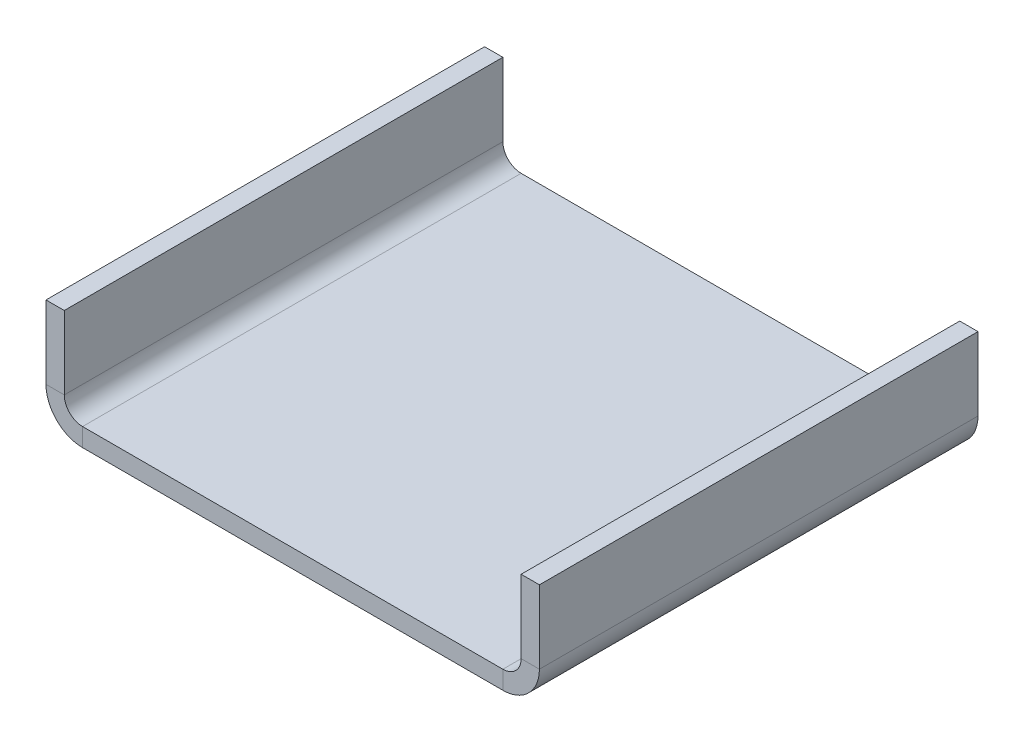
ISO-10303-21;
HEADER;
FILE_DESCRIPTION(('STEP AP214'),'2;1');
FILE_NAME('part.step','',(''),(''),'','','');
FILE_SCHEMA(('AUTOMOTIVE_DESIGN { 1 0 10303 214 1 1 1 1 }'));
ENDSEC;
DATA;
#1=APPLICATION_CONTEXT('core data for automotive mechanical design processes');
#2=APPLICATION_PROTOCOL_DEFINITION('international standard','automotive_design',2000,#1);
#3=PRODUCT_CONTEXT('',#1,'mechanical');
#4=PRODUCT('Part','Part','',(#3));
#5=PRODUCT_RELATED_PRODUCT_CATEGORY('part','',(#4));
#6=PRODUCT_DEFINITION_FORMATION('','',#4);
#7=PRODUCT_DEFINITION_CONTEXT('part definition',#1,'design');
#8=PRODUCT_DEFINITION('design','',#6,#7);
#9=PRODUCT_DEFINITION_SHAPE('','',#8);
#10=(LENGTH_UNIT() NAMED_UNIT(*) SI_UNIT(.MILLI.,.METRE.));
#11=(NAMED_UNIT(*) PLANE_ANGLE_UNIT() SI_UNIT($,.RADIAN.));
#12=(NAMED_UNIT(*) SI_UNIT($,.STERADIAN.) SOLID_ANGLE_UNIT());
#13=UNCERTAINTY_MEASURE_WITH_UNIT(LENGTH_MEASURE(1.E-05),#10,'distance_accuracy_value','');
#14=(GEOMETRIC_REPRESENTATION_CONTEXT(3) GLOBAL_UNCERTAINTY_ASSIGNED_CONTEXT((#13)) GLOBAL_UNIT_ASSIGNED_CONTEXT((#10,
#11,#12)) REPRESENTATION_CONTEXT('',''));
#15=CARTESIAN_POINT('',(0.,0.,0.));
#16=DIRECTION('',(0.,0.,1.));
#17=DIRECTION('',(1.,0.,0.));
#18=AXIS2_PLACEMENT_3D('',#15,#16,#17);
#19=CARTESIAN_POINT('',(0.,6.35,76.2));
#20=DIRECTION('',(0.,0.,1.));
#21=DIRECTION('',(1.,0.,0.));
#22=AXIS2_PLACEMENT_3D('',#19,#20,#21);
#23=PLANE('',#22);
#24=DIRECTION('',(1.,0.,0.));
#25=VECTOR('',#24,1.);
#26=CARTESIAN_POINT('',(0.,6.35,76.2));
#27=LINE('',#26,#25);
#28=CARTESIAN_POINT('',(0.,6.35,76.2));
#29=VERTEX_POINT('',#28);
#30=CARTESIAN_POINT('',(3.175,6.35,76.2));
#31=VERTEX_POINT('',#30);
#32=EDGE_CURVE('E11',#29,#31,#27,.T.);
#33=ORIENTED_EDGE('',*,*,#32,.F.);
#34=CARTESIAN_POINT('',(6.35,6.35,76.2));
#35=DIRECTION('',(0.,0.,-1.));
#36=DIRECTION('',(-1.,0.,0.));
#37=AXIS2_PLACEMENT_3D('',#34,#35,#36);
#38=CIRCLE('',#37,6.35);
#39=CARTESIAN_POINT('',(6.35,0.,76.2));
#40=VERTEX_POINT('',#39);
#41=EDGE_CURVE('E147',#29,#40,#38,.F.);
#42=ORIENTED_EDGE('',*,*,#41,.T.);
#43=DIRECTION('',(0.,-1.,0.));
#44=VECTOR('',#43,1.);
#45=CARTESIAN_POINT('',(6.35,3.175,76.2));
#46=LINE('',#45,#44);
#47=CARTESIAN_POINT('',(6.35,3.175,76.2));
#48=VERTEX_POINT('',#47);
#49=EDGE_CURVE('E45',#48,#40,#46,.T.);
#50=ORIENTED_EDGE('',*,*,#49,.F.);
#51=CARTESIAN_POINT('',(6.35,6.35,76.2));
#52=DIRECTION('',(0.,0.,1.));
#53=DIRECTION('',(1.,0.,0.));
#54=AXIS2_PLACEMENT_3D('',#51,#52,#53);
#55=CIRCLE('',#54,3.175);
#56=EDGE_CURVE('E241',#31,#48,#55,.T.);
#57=ORIENTED_EDGE('',*,*,#56,.F.);
#58=EDGE_LOOP('',(#33,#42,#50,#57));
#59=FACE_BOUND('',#58,.T.);
#60=ADVANCED_FACE('F37',(#59),#23,.T.);
#61=CARTESIAN_POINT('',(6.35,3.175,76.2));
#62=DIRECTION('',(0.,0.,1.));
#63=DIRECTION('',(1.,0.,0.));
#64=AXIS2_PLACEMENT_3D('',#61,#62,#63);
#65=PLANE('',#64);
#66=DIRECTION('',(0.,-1.,0.));
#67=VECTOR('',#66,1.);
#68=CARTESIAN_POINT('',(0.,0.,76.2));
#69=LINE('',#68,#67);
#70=CARTESIAN_POINT('',(0.,19.05,76.2));
#71=VERTEX_POINT('',#70);
#72=EDGE_CURVE('E152',#71,#29,#69,.T.);
#73=ORIENTED_EDGE('',*,*,#72,.T.);
#74=ORIENTED_EDGE('',*,*,#32,.T.);
#75=DIRECTION('',(0.,1.,0.));
#76=VECTOR('',#75,1.);
#77=CARTESIAN_POINT('',(3.175,0.,76.2));
#78=LINE('',#77,#76);
#79=CARTESIAN_POINT('',(3.175,19.05,76.2));
#80=VERTEX_POINT('',#79);
#81=EDGE_CURVE('E254',#80,#31,#78,.F.);
#82=ORIENTED_EDGE('',*,*,#81,.F.);
#83=DIRECTION('',(1.,0.,0.));
#84=VECTOR('',#83,1.);
#85=CARTESIAN_POINT('',(0.,19.05,76.2));
#86=LINE('',#85,#84);
#87=EDGE_CURVE('E256',#71,#80,#86,.T.);
#88=ORIENTED_EDGE('',*,*,#87,.F.);
#89=EDGE_LOOP('',(#73,#74,#82,#88));
#90=FACE_BOUND('',#89,.T.);
#91=ADVANCED_FACE('F267',(#90),#65,.T.);
#92=CARTESIAN_POINT('',(6.35,0.,0.));
#93=DIRECTION('',(0.,0.,-1.));
#94=DIRECTION('',(-1.,0.,0.));
#95=AXIS2_PLACEMENT_3D('',#92,#93,#94);
#96=PLANE('',#95);
#97=DIRECTION('',(0.,1.,0.));
#98=VECTOR('',#97,1.);
#99=CARTESIAN_POINT('',(6.35,0.,0.));
#100=LINE('',#99,#98);
#101=CARTESIAN_POINT('',(6.35,0.,0.));
#102=VERTEX_POINT('',#101);
#103=CARTESIAN_POINT('',(6.35,3.175,0.));
#104=VERTEX_POINT('',#103);
#105=EDGE_CURVE('E145',#102,#104,#100,.T.);
#106=ORIENTED_EDGE('',*,*,#105,.F.);
#107=CARTESIAN_POINT('',(6.35,6.35,0.));
#108=DIRECTION('',(0.,0.,-1.));
#109=DIRECTION('',(-1.,0.,0.));
#110=AXIS2_PLACEMENT_3D('',#107,#108,#109);
#111=CIRCLE('',#110,6.35);
#112=CARTESIAN_POINT('',(0.,6.35,0.));
#113=VERTEX_POINT('',#112);
#114=EDGE_CURVE('E159',#113,#102,#111,.F.);
#115=ORIENTED_EDGE('',*,*,#114,.F.);
#116=DIRECTION('',(-1.,0.,0.));
#117=VECTOR('',#116,1.);
#118=CARTESIAN_POINT('',(3.175,6.35,0.));
#119=LINE('',#118,#117);
#120=CARTESIAN_POINT('',(3.175,6.35,0.));
#121=VERTEX_POINT('',#120);
#122=EDGE_CURVE('E232',#121,#113,#119,.T.);
#123=ORIENTED_EDGE('',*,*,#122,.F.);
#124=CARTESIAN_POINT('',(6.35,6.35,0.));
#125=DIRECTION('',(0.,0.,1.));
#126=DIRECTION('',(1.,0.,0.));
#127=AXIS2_PLACEMENT_3D('',#124,#125,#126);
#128=CIRCLE('',#127,3.175);
#129=EDGE_CURVE('E186',#121,#104,#128,.T.);
#130=ORIENTED_EDGE('',*,*,#129,.T.);
#131=EDGE_LOOP('',(#106,#115,#123,#130));
#132=FACE_BOUND('',#131,.T.);
#133=ADVANCED_FACE('F246',(#132),#96,.T.);
#134=CARTESIAN_POINT('',(3.175,6.35,0.));
#135=DIRECTION('',(0.,0.,-1.));
#136=DIRECTION('',(-1.,0.,0.));
#137=AXIS2_PLACEMENT_3D('',#134,#135,#136);
#138=PLANE('',#137);
#139=DIRECTION('',(1.,0.,0.));
#140=VECTOR('',#139,1.);
#141=CARTESIAN_POINT('',(0.,0.,0.));
#142=LINE('',#141,#140);
#143=CARTESIAN_POINT('',(79.375,0.,0.));
#144=VERTEX_POINT('',#143);
#145=EDGE_CURVE('E199',#102,#144,#142,.T.);
#146=ORIENTED_EDGE('',*,*,#145,.F.);
#147=ORIENTED_EDGE('',*,*,#105,.T.);
#148=DIRECTION('',(1.,0.,0.));
#149=VECTOR('',#148,1.);
#150=CARTESIAN_POINT('',(0.,3.175,0.));
#151=LINE('',#150,#149);
#152=CARTESIAN_POINT('',(79.375,3.175,0.));
#153=VERTEX_POINT('',#152);
#154=EDGE_CURVE('E184',#104,#153,#151,.T.);
#155=ORIENTED_EDGE('',*,*,#154,.T.);
#156=DIRECTION('',(0.,-1.,0.));
#157=VECTOR('',#156,1.);
#158=CARTESIAN_POINT('',(79.375,3.175,0.));
#159=LINE('',#158,#157);
#160=EDGE_CURVE('E94',#153,#144,#159,.T.);
#161=ORIENTED_EDGE('',*,*,#160,.T.);
#162=EDGE_LOOP('',(#146,#147,#155,#161));
#163=FACE_BOUND('',#162,.T.);
#164=ADVANCED_FACE('F234',(#163),#138,.T.);
#165=CARTESIAN_POINT('',(79.375,0.,76.2));
#166=DIRECTION('',(0.,0.,1.));
#167=DIRECTION('',(1.,0.,0.));
#168=AXIS2_PLACEMENT_3D('',#165,#166,#167);
#169=PLANE('',#168);
#170=DIRECTION('',(0.,1.,0.));
#171=VECTOR('',#170,1.);
#172=CARTESIAN_POINT('',(79.375,0.,76.2));
#173=LINE('',#172,#171);
#174=CARTESIAN_POINT('',(79.375,0.,76.2));
#175=VERTEX_POINT('',#174);
#176=CARTESIAN_POINT('',(79.375,3.175,76.2));
#177=VERTEX_POINT('',#176);
#178=EDGE_CURVE('E230',#175,#177,#173,.T.);
#179=ORIENTED_EDGE('',*,*,#178,.F.);
#180=CARTESIAN_POINT('',(79.375,6.35,76.2));
#181=DIRECTION('',(0.,0.,-1.));
#182=DIRECTION('',(-1.,0.,0.));
#183=AXIS2_PLACEMENT_3D('',#180,#181,#182);
#184=CIRCLE('',#183,6.35);
#185=CARTESIAN_POINT('',(85.725,6.35,76.2));
#186=VERTEX_POINT('',#185);
#187=EDGE_CURVE('E167',#175,#186,#184,.F.);
#188=ORIENTED_EDGE('',*,*,#187,.T.);
#189=DIRECTION('',(1.,0.,0.));
#190=VECTOR('',#189,1.);
#191=CARTESIAN_POINT('',(82.55,6.35,76.2));
#192=LINE('',#191,#190);
#193=CARTESIAN_POINT('',(82.55,6.35,76.2));
#194=VERTEX_POINT('',#193);
#195=EDGE_CURVE('E53',#194,#186,#192,.T.);
#196=ORIENTED_EDGE('',*,*,#195,.F.);
#197=CARTESIAN_POINT('',(79.375,6.35,76.2));
#198=DIRECTION('',(0.,0.,1.));
#199=DIRECTION('',(1.,0.,0.));
#200=AXIS2_PLACEMENT_3D('',#197,#198,#199);
#201=CIRCLE('',#200,3.175);
#202=EDGE_CURVE('E258',#177,#194,#201,.T.);
#203=ORIENTED_EDGE('',*,*,#202,.F.);
#204=EDGE_LOOP('',(#179,#188,#196,#203));
#205=FACE_BOUND('',#204,.T.);
#206=ADVANCED_FACE('F293',(#205),#169,.T.);
#207=CARTESIAN_POINT('',(82.55,6.35,76.2));
#208=DIRECTION('',(0.,0.,1.));
#209=DIRECTION('',(1.,0.,0.));
#210=AXIS2_PLACEMENT_3D('',#207,#208,#209);
#211=PLANE('',#210);
#212=DIRECTION('',(1.,0.,0.));
#213=VECTOR('',#212,1.);
#214=CARTESIAN_POINT('',(0.,0.,76.2));
#215=LINE('',#214,#213);
#216=EDGE_CURVE('E137',#40,#175,#215,.T.);
#217=ORIENTED_EDGE('',*,*,#216,.T.);
#218=ORIENTED_EDGE('',*,*,#178,.T.);
#219=DIRECTION('',(1.,0.,0.));
#220=VECTOR('',#219,1.);
#221=CARTESIAN_POINT('',(0.,3.175,76.2));
#222=LINE('',#221,#220);
#223=EDGE_CURVE('E140',#48,#177,#222,.T.);
#224=ORIENTED_EDGE('',*,*,#223,.F.);
#225=ORIENTED_EDGE('',*,*,#49,.T.);
#226=EDGE_LOOP('',(#217,#218,#224,#225));
#227=FACE_BOUND('',#226,.T.);
#228=ADVANCED_FACE('F135',(#227),#211,.T.);
#229=CARTESIAN_POINT('',(85.725,6.35,0.));
#230=DIRECTION('',(0.,0.,-1.));
#231=DIRECTION('',(-1.,0.,0.));
#232=AXIS2_PLACEMENT_3D('',#229,#230,#231);
#233=PLANE('',#232);
#234=DIRECTION('',(-1.,0.,0.));
#235=VECTOR('',#234,1.);
#236=CARTESIAN_POINT('',(85.725,6.35,0.));
#237=LINE('',#236,#235);
#238=CARTESIAN_POINT('',(85.725,6.35,0.));
#239=VERTEX_POINT('',#238);
#240=CARTESIAN_POINT('',(82.55,6.35,0.));
#241=VERTEX_POINT('',#240);
#242=EDGE_CURVE('E101',#239,#241,#237,.T.);
#243=ORIENTED_EDGE('',*,*,#242,.F.);
#244=CARTESIAN_POINT('',(79.375,6.35,0.));
#245=DIRECTION('',(0.,0.,-1.));
#246=DIRECTION('',(-1.,0.,0.));
#247=AXIS2_PLACEMENT_3D('',#244,#245,#246);
#248=CIRCLE('',#247,6.35);
#249=EDGE_CURVE('E201',#144,#239,#248,.F.);
#250=ORIENTED_EDGE('',*,*,#249,.F.);
#251=ORIENTED_EDGE('',*,*,#160,.F.);
#252=CARTESIAN_POINT('',(79.375,6.35,0.));
#253=DIRECTION('',(0.,0.,1.));
#254=DIRECTION('',(1.,0.,0.));
#255=AXIS2_PLACEMENT_3D('',#252,#253,#254);
#256=CIRCLE('',#255,3.175);
#257=EDGE_CURVE('E182',#153,#241,#256,.T.);
#258=ORIENTED_EDGE('',*,*,#257,.T.);
#259=EDGE_LOOP('',(#243,#250,#251,#258));
#260=FACE_BOUND('',#259,.T.);
#261=ADVANCED_FACE('F299',(#260),#233,.T.);
#262=CARTESIAN_POINT('',(79.375,3.175,0.));
#263=DIRECTION('',(0.,0.,-1.));
#264=DIRECTION('',(-1.,0.,0.));
#265=AXIS2_PLACEMENT_3D('',#262,#263,#264);
#266=PLANE('',#265);
#267=DIRECTION('',(0.,1.,0.));
#268=VECTOR('',#267,1.);
#269=CARTESIAN_POINT('',(85.725,0.,0.));
#270=LINE('',#269,#268);
#271=CARTESIAN_POINT('',(85.725,19.05,0.));
#272=VERTEX_POINT('',#271);
#273=EDGE_CURVE('E173',#239,#272,#270,.T.);
#274=ORIENTED_EDGE('',*,*,#273,.F.);
#275=ORIENTED_EDGE('',*,*,#242,.T.);
#276=DIRECTION('',(0.,1.,0.));
#277=VECTOR('',#276,1.);
#278=CARTESIAN_POINT('',(82.55,0.,0.));
#279=LINE('',#278,#277);
#280=CARTESIAN_POINT('',(82.55,19.05,0.));
#281=VERTEX_POINT('',#280);
#282=EDGE_CURVE('E179',#241,#281,#279,.T.);
#283=ORIENTED_EDGE('',*,*,#282,.T.);
#284=DIRECTION('',(1.,0.,0.));
#285=VECTOR('',#284,1.);
#286=CARTESIAN_POINT('',(82.55,19.05,0.));
#287=LINE('',#286,#285);
#288=EDGE_CURVE('E176',#281,#272,#287,.T.);
#289=ORIENTED_EDGE('',*,*,#288,.T.);
#290=EDGE_LOOP('',(#274,#275,#283,#289));
#291=FACE_BOUND('',#290,.T.);
#292=ADVANCED_FACE('F302',(#291),#266,.T.);
#293=CARTESIAN_POINT('',(85.725,0.,76.2));
#294=DIRECTION('',(-1.,0.,0.));
#295=DIRECTION('',(0.,0.,1.));
#296=AXIS2_PLACEMENT_3D('',#293,#294,#295);
#297=PLANE('',#296);
#298=ORIENTED_EDGE('',*,*,#273,.T.);
#299=DIRECTION('',(0.,0.,-1.));
#300=VECTOR('',#299,1.);
#301=CARTESIAN_POINT('',(85.725,19.05,76.2));
#302=LINE('',#301,#300);
#303=CARTESIAN_POINT('',(85.725,19.05,76.2));
#304=VERTEX_POINT('',#303);
#305=EDGE_CURVE('E225',#304,#272,#302,.T.);
#306=ORIENTED_EDGE('',*,*,#305,.F.);
#307=DIRECTION('',(0.,1.,0.));
#308=VECTOR('',#307,1.);
#309=CARTESIAN_POINT('',(85.725,0.,76.2));
#310=LINE('',#309,#308);
#311=EDGE_CURVE('E107',#186,#304,#310,.T.);
#312=ORIENTED_EDGE('',*,*,#311,.F.);
#313=DIRECTION('',(0.,0.,-1.));
#314=VECTOR('',#313,1.);
#315=CARTESIAN_POINT('',(85.725,6.35,76.2));
#316=LINE('',#315,#314);
#317=EDGE_CURVE('E169',#186,#239,#316,.T.);
#318=ORIENTED_EDGE('',*,*,#317,.T.);
#319=EDGE_LOOP('',(#298,#306,#312,#318));
#320=FACE_BOUND('',#319,.T.);
#321=ADVANCED_FACE('F305',(#320),#297,.F.);
#322=CARTESIAN_POINT('',(82.55,19.05,76.2));
#323=DIRECTION('',(0.,1.,0.));
#324=DIRECTION('',(0.,0.,1.));
#325=AXIS2_PLACEMENT_3D('',#322,#323,#324);
#326=PLANE('',#325);
#327=ORIENTED_EDGE('',*,*,#288,.F.);
#328=DIRECTION('',(0.,0.,-1.));
#329=VECTOR('',#328,1.);
#330=CARTESIAN_POINT('',(82.55,19.05,76.2));
#331=LINE('',#330,#329);
#332=CARTESIAN_POINT('',(82.55,19.05,76.2));
#333=VERTEX_POINT('',#332);
#334=EDGE_CURVE('E223',#333,#281,#331,.T.);
#335=ORIENTED_EDGE('',*,*,#334,.F.);
#336=DIRECTION('',(1.,0.,0.));
#337=VECTOR('',#336,1.);
#338=CARTESIAN_POINT('',(82.55,19.05,76.2));
#339=LINE('',#338,#337);
#340=EDGE_CURVE('E513',#333,#304,#339,.T.);
#341=ORIENTED_EDGE('',*,*,#340,.T.);
#342=ORIENTED_EDGE('',*,*,#305,.T.);
#343=EDGE_LOOP('',(#327,#335,#341,#342));
#344=FACE_BOUND('',#343,.T.);
#345=ADVANCED_FACE('F309',(#344),#326,.T.);
#346=CARTESIAN_POINT('',(82.55,0.,76.2));
#347=DIRECTION('',(-1.,0.,0.));
#348=DIRECTION('',(0.,0.,1.));
#349=AXIS2_PLACEMENT_3D('',#346,#347,#348);
#350=PLANE('',#349);
#351=ORIENTED_EDGE('',*,*,#282,.F.);
#352=DIRECTION('',(0.,0.,-1.));
#353=VECTOR('',#352,1.);
#354=CARTESIAN_POINT('',(82.55,6.35,76.2));
#355=LINE('',#354,#353);
#356=EDGE_CURVE('E220',#194,#241,#355,.T.);
#357=ORIENTED_EDGE('',*,*,#356,.F.);
#358=DIRECTION('',(0.,1.,0.));
#359=VECTOR('',#358,1.);
#360=CARTESIAN_POINT('',(82.55,0.,76.2));
#361=LINE('',#360,#359);
#362=EDGE_CURVE('E515',#194,#333,#361,.T.);
#363=ORIENTED_EDGE('',*,*,#362,.T.);
#364=ORIENTED_EDGE('',*,*,#334,.T.);
#365=EDGE_LOOP('',(#351,#357,#363,#364));
#366=FACE_BOUND('',#365,.T.);
#367=ADVANCED_FACE('F313',(#366),#350,.T.);
#368=CARTESIAN_POINT('',(79.375,6.35,76.2));
#369=DIRECTION('',(0.,0.,-1.));
#370=DIRECTION('',(-1.,0.,0.));
#371=AXIS2_PLACEMENT_3D('',#368,#369,#370);
#372=CYLINDRICAL_SURFACE('',#371,3.175);
#373=ORIENTED_EDGE('',*,*,#257,.F.);
#374=DIRECTION('',(0.,0.,-1.));
#375=VECTOR('',#374,1.);
#376=CARTESIAN_POINT('',(79.375,3.175,76.2));
#377=LINE('',#376,#375);
#378=EDGE_CURVE('E217',#177,#153,#377,.T.);
#379=ORIENTED_EDGE('',*,*,#378,.F.);
#380=ORIENTED_EDGE('',*,*,#202,.T.);
#381=ORIENTED_EDGE('',*,*,#356,.T.);
#382=EDGE_LOOP('',(#373,#379,#380,#381));
#383=FACE_BOUND('',#382,.T.);
#384=ADVANCED_FACE('F317',(#383),#372,.F.);
#385=CARTESIAN_POINT('',(0.,3.175,76.2));
#386=DIRECTION('',(0.,1.,0.));
#387=DIRECTION('',(0.,0.,1.));
#388=AXIS2_PLACEMENT_3D('',#385,#386,#387);
#389=PLANE('',#388);
#390=ORIENTED_EDGE('',*,*,#154,.F.);
#391=DIRECTION('',(0.,0.,-1.));
#392=VECTOR('',#391,1.);
#393=CARTESIAN_POINT('',(6.35,3.175,76.2));
#394=LINE('',#393,#392);
#395=EDGE_CURVE('E214',#48,#104,#394,.T.);
#396=ORIENTED_EDGE('',*,*,#395,.F.);
#397=ORIENTED_EDGE('',*,*,#223,.T.);
#398=ORIENTED_EDGE('',*,*,#378,.T.);
#399=EDGE_LOOP('',(#390,#396,#397,#398));
#400=FACE_BOUND('',#399,.T.);
#401=ADVANCED_FACE('F243',(#400),#389,.T.);
#402=CARTESIAN_POINT('',(6.35,6.35,76.2));
#403=DIRECTION('',(0.,0.,-1.));
#404=DIRECTION('',(-1.,0.,0.));
#405=AXIS2_PLACEMENT_3D('',#402,#403,#404);
#406=CYLINDRICAL_SURFACE('',#405,3.175);
#407=ORIENTED_EDGE('',*,*,#129,.F.);
#408=DIRECTION('',(0.,0.,-1.));
#409=VECTOR('',#408,1.);
#410=CARTESIAN_POINT('',(3.175,6.35,76.2));
#411=LINE('',#410,#409);
#412=EDGE_CURVE('E211',#31,#121,#411,.T.);
#413=ORIENTED_EDGE('',*,*,#412,.F.);
#414=ORIENTED_EDGE('',*,*,#56,.T.);
#415=ORIENTED_EDGE('',*,*,#395,.T.);
#416=EDGE_LOOP('',(#407,#413,#414,#415));
#417=FACE_BOUND('',#416,.T.);
#418=ADVANCED_FACE('F239',(#417),#406,.F.);
#419=CARTESIAN_POINT('',(3.175,0.,76.2));
#420=DIRECTION('',(1.,0.,0.));
#421=DIRECTION('',(0.,0.,-1.));
#422=AXIS2_PLACEMENT_3D('',#419,#420,#421);
#423=PLANE('',#422);
#424=DIRECTION('',(0.,1.,0.));
#425=VECTOR('',#424,1.);
#426=CARTESIAN_POINT('',(3.175,0.,0.));
#427=LINE('',#426,#425);
#428=CARTESIAN_POINT('',(3.175,19.05,0.));
#429=VERTEX_POINT('',#428);
#430=EDGE_CURVE('E189',#429,#121,#427,.F.);
#431=ORIENTED_EDGE('',*,*,#430,.F.);
#432=DIRECTION('',(0.,0.,-1.));
#433=VECTOR('',#432,1.);
#434=CARTESIAN_POINT('',(3.175,19.05,76.2));
#435=LINE('',#434,#433);
#436=EDGE_CURVE('E209',#80,#429,#435,.T.);
#437=ORIENTED_EDGE('',*,*,#436,.F.);
#438=ORIENTED_EDGE('',*,*,#81,.T.);
#439=ORIENTED_EDGE('',*,*,#412,.T.);
#440=EDGE_LOOP('',(#431,#437,#438,#439));
#441=FACE_BOUND('',#440,.T.);
#442=ADVANCED_FACE('F252',(#441),#423,.T.);
#443=CARTESIAN_POINT('',(0.,19.05,76.2));
#444=DIRECTION('',(0.,1.,0.));
#445=DIRECTION('',(0.,0.,1.));
#446=AXIS2_PLACEMENT_3D('',#443,#444,#445);
#447=PLANE('',#446);
#448=DIRECTION('',(1.,0.,0.));
#449=VECTOR('',#448,1.);
#450=CARTESIAN_POINT('',(0.,19.05,0.));
#451=LINE('',#450,#449);
#452=CARTESIAN_POINT('',(0.,19.05,0.));
#453=VERTEX_POINT('',#452);
#454=EDGE_CURVE('E192',#453,#429,#451,.T.);
#455=ORIENTED_EDGE('',*,*,#454,.F.);
#456=DIRECTION('',(0.,0.,-1.));
#457=VECTOR('',#456,1.);
#458=CARTESIAN_POINT('',(0.,19.05,76.2));
#459=LINE('',#458,#457);
#460=EDGE_CURVE('E207',#71,#453,#459,.T.);
#461=ORIENTED_EDGE('',*,*,#460,.F.);
#462=ORIENTED_EDGE('',*,*,#87,.T.);
#463=ORIENTED_EDGE('',*,*,#436,.T.);
#464=EDGE_LOOP('',(#455,#461,#462,#463));
#465=FACE_BOUND('',#464,.T.);
#466=ADVANCED_FACE('F273',(#465),#447,.T.);
#467=CARTESIAN_POINT('',(0.,0.,76.2));
#468=DIRECTION('',(1.,0.,0.));
#469=DIRECTION('',(0.,0.,-1.));
#470=AXIS2_PLACEMENT_3D('',#467,#468,#469);
#471=PLANE('',#470);
#472=DIRECTION('',(0.,-1.,0.));
#473=VECTOR('',#472,1.);
#474=CARTESIAN_POINT('',(0.,0.,0.));
#475=LINE('',#474,#473);
#476=EDGE_CURVE('E195',#453,#113,#475,.T.);
#477=ORIENTED_EDGE('',*,*,#476,.T.);
#478=DIRECTION('',(0.,0.,-1.));
#479=VECTOR('',#478,1.);
#480=CARTESIAN_POINT('',(0.,6.35,76.2));
#481=LINE('',#480,#479);
#482=EDGE_CURVE('E161',#29,#113,#481,.T.);
#483=ORIENTED_EDGE('',*,*,#482,.F.);
#484=ORIENTED_EDGE('',*,*,#72,.F.);
#485=ORIENTED_EDGE('',*,*,#460,.T.);
#486=EDGE_LOOP('',(#477,#483,#484,#485));
#487=FACE_BOUND('',#486,.T.);
#488=ADVANCED_FACE('F269',(#487),#471,.F.);
#489=CARTESIAN_POINT('',(6.35,6.35,76.2));
#490=DIRECTION('',(0.,0.,-1.));
#491=DIRECTION('',(-1.,0.,0.));
#492=AXIS2_PLACEMENT_3D('',#489,#490,#491);
#493=CYLINDRICAL_SURFACE('',#492,6.35);
#494=ORIENTED_EDGE('',*,*,#114,.T.);
#495=DIRECTION('',(0.,0.,-1.));
#496=VECTOR('',#495,1.);
#497=CARTESIAN_POINT('',(6.35,0.,76.2));
#498=LINE('',#497,#496);
#499=EDGE_CURVE('E156',#40,#102,#498,.T.);
#500=ORIENTED_EDGE('',*,*,#499,.F.);
#501=ORIENTED_EDGE('',*,*,#41,.F.);
#502=ORIENTED_EDGE('',*,*,#482,.T.);
#503=EDGE_LOOP('',(#494,#500,#501,#502));
#504=FACE_BOUND('',#503,.T.);
#505=ADVANCED_FACE('F157',(#504),#493,.T.);
#506=CARTESIAN_POINT('',(0.,0.,76.2));
#507=DIRECTION('',(0.,1.,0.));
#508=DIRECTION('',(0.,0.,1.));
#509=AXIS2_PLACEMENT_3D('',#506,#507,#508);
#510=PLANE('',#509);
#511=ORIENTED_EDGE('',*,*,#145,.T.);
#512=DIRECTION('',(0.,0.,-1.));
#513=VECTOR('',#512,1.);
#514=CARTESIAN_POINT('',(79.375,0.,76.2));
#515=LINE('',#514,#513);
#516=EDGE_CURVE('E162',#175,#144,#515,.T.);
#517=ORIENTED_EDGE('',*,*,#516,.F.);
#518=ORIENTED_EDGE('',*,*,#216,.F.);
#519=ORIENTED_EDGE('',*,*,#499,.T.);
#520=EDGE_LOOP('',(#511,#517,#518,#519));
#521=FACE_BOUND('',#520,.T.);
#522=ADVANCED_FACE('F164',(#521),#510,.F.);
#523=CARTESIAN_POINT('',(79.375,6.35,76.2));
#524=DIRECTION('',(0.,0.,-1.));
#525=DIRECTION('',(-1.,0.,0.));
#526=AXIS2_PLACEMENT_3D('',#523,#524,#525);
#527=CYLINDRICAL_SURFACE('',#526,6.35);
#528=ORIENTED_EDGE('',*,*,#249,.T.);
#529=ORIENTED_EDGE('',*,*,#317,.F.);
#530=ORIENTED_EDGE('',*,*,#187,.F.);
#531=ORIENTED_EDGE('',*,*,#516,.T.);
#532=EDGE_LOOP('',(#528,#529,#530,#531));
#533=FACE_BOUND('',#532,.T.);
#534=ADVANCED_FACE('F364',(#533),#527,.T.);
#535=CARTESIAN_POINT('',(79.375,6.35,76.2));
#536=DIRECTION('',(0.,0.,1.));
#537=DIRECTION('',(1.,0.,0.));
#538=AXIS2_PLACEMENT_3D('',#535,#536,#537);
#539=PLANE('',#538);
#540=ORIENTED_EDGE('',*,*,#311,.T.);
#541=ORIENTED_EDGE('',*,*,#340,.F.);
#542=ORIENTED_EDGE('',*,*,#362,.F.);
#543=ORIENTED_EDGE('',*,*,#195,.T.);
#544=EDGE_LOOP('',(#540,#541,#542,#543));
#545=FACE_BOUND('',#544,.T.);
#546=ADVANCED_FACE('F374',(#545),#539,.T.);
#547=CARTESIAN_POINT('',(79.375,6.35,0.));
#548=DIRECTION('',(0.,0.,1.));
#549=DIRECTION('',(1.,0.,0.));
#550=AXIS2_PLACEMENT_3D('',#547,#548,#549);
#551=PLANE('',#550);
#552=ORIENTED_EDGE('',*,*,#430,.T.);
#553=ORIENTED_EDGE('',*,*,#122,.T.);
#554=ORIENTED_EDGE('',*,*,#476,.F.);
#555=ORIENTED_EDGE('',*,*,#454,.T.);
#556=EDGE_LOOP('',(#552,#553,#554,#555));
#557=FACE_BOUND('',#556,.T.);
#558=ADVANCED_FACE('F271',(#557),#551,.F.);
#559=CLOSED_SHELL('',(#60,#91,#133,#164,#206,#228,#261,#292,#321,#345,#367,#384,#401,#418,#442,
#466,#488,#505,#522,#534,#546,#558));
#560=MANIFOLD_SOLID_BREP('B2',#559);
#561=ADVANCED_BREP_SHAPE_REPRESENTATION('',(#18,#560),#14);
#562=SHAPE_DEFINITION_REPRESENTATION(#9,#561);
ENDSEC;
END-ISO-10303-21;
